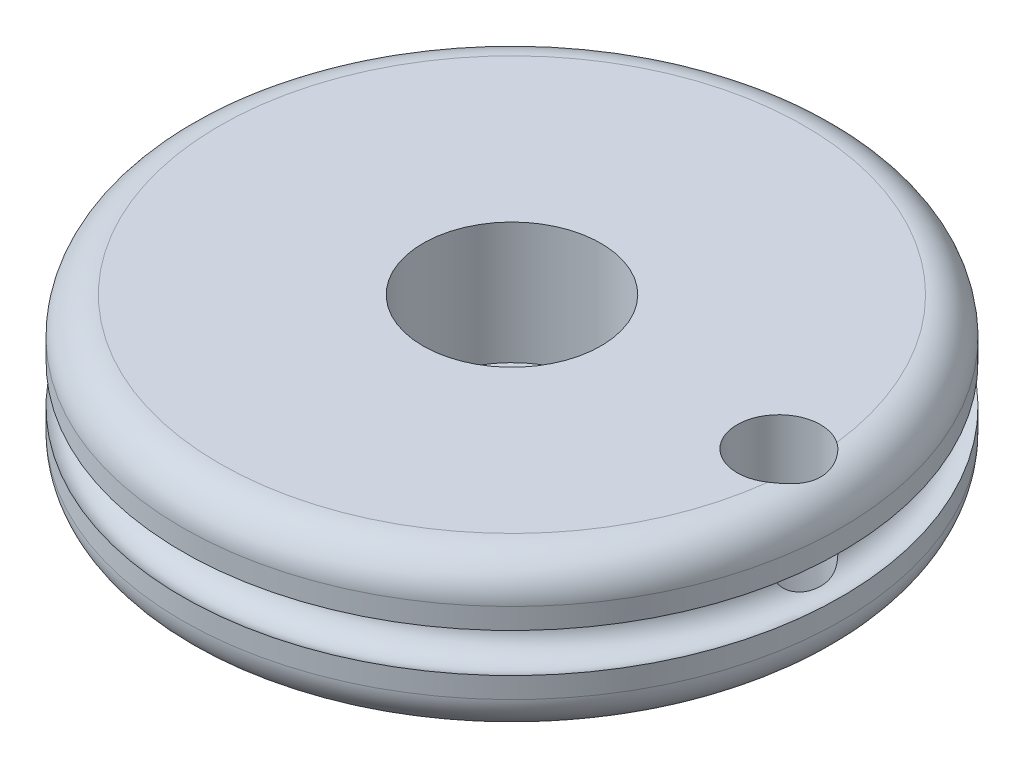
ISO-10303-21;
HEADER;
FILE_DESCRIPTION(('STEP AP214'),'2;1');
FILE_NAME('part.step','',(''),(''),'','','');
FILE_SCHEMA(('AUTOMOTIVE_DESIGN { 1 0 10303 214 1 1 1 1 }'));
ENDSEC;
DATA;
#1=APPLICATION_CONTEXT('core data for automotive mechanical design processes');
#2=APPLICATION_PROTOCOL_DEFINITION('international standard','automotive_design',2000,#1);
#3=PRODUCT_CONTEXT('',#1,'mechanical');
#4=PRODUCT('Part','Part','',(#3));
#5=PRODUCT_RELATED_PRODUCT_CATEGORY('part','',(#4));
#6=PRODUCT_DEFINITION_FORMATION('','',#4);
#7=PRODUCT_DEFINITION_CONTEXT('part definition',#1,'design');
#8=PRODUCT_DEFINITION('design','',#6,#7);
#9=PRODUCT_DEFINITION_SHAPE('','',#8);
#10=(LENGTH_UNIT() NAMED_UNIT(*) SI_UNIT(.MILLI.,.METRE.));
#11=(NAMED_UNIT(*) PLANE_ANGLE_UNIT() SI_UNIT($,.RADIAN.));
#12=(NAMED_UNIT(*) SI_UNIT($,.STERADIAN.) SOLID_ANGLE_UNIT());
#13=UNCERTAINTY_MEASURE_WITH_UNIT(LENGTH_MEASURE(1.E-05),#10,'distance_accuracy_value','');
#14=(GEOMETRIC_REPRESENTATION_CONTEXT(3) GLOBAL_UNCERTAINTY_ASSIGNED_CONTEXT((#13)) GLOBAL_UNIT_ASSIGNED_CONTEXT((#10,
#11,#12)) REPRESENTATION_CONTEXT('',''));
#15=CARTESIAN_POINT('',(0.,0.,0.));
#16=DIRECTION('',(0.,0.,1.));
#17=DIRECTION('',(1.,0.,0.));
#18=AXIS2_PLACEMENT_3D('',#15,#16,#17);
#19=CARTESIAN_POINT('',(0.,4.175,0.));
#20=DIRECTION('',(0.,-1.,0.));
#21=DIRECTION('',(0.,0.,-1.));
#22=AXIS2_PLACEMENT_3D('',#19,#20,#21);
#23=CYLINDRICAL_SURFACE('',#22,8.88999999999999);
#24=CARTESIAN_POINT('',(0.,1.,0.));
#25=DIRECTION('',(0.,1.,0.));
#26=DIRECTION('',(0.,0.,1.));
#27=AXIS2_PLACEMENT_3D('',#24,#25,#26);
#28=CIRCLE('',#27,8.88999999999999);
#29=CARTESIAN_POINT('',(0.,1.,8.88999999999999));
#30=VERTEX_POINT('',#29);
#31=EDGE_CURVE('E110',#30,#30,#28,.T.);
#32=ORIENTED_EDGE('',*,*,#31,.T.);
#33=EDGE_LOOP('',(#32));
#34=FACE_BOUND('',#33,.T.);
#35=CARTESIAN_POINT('',(0.,1.56079443709032,0.));
#36=DIRECTION('',(0.,1.,0.));
#37=DIRECTION('',(0.,0.,1.));
#38=AXIS2_PLACEMENT_3D('',#35,#36,#37);
#39=CIRCLE('',#38,8.88999999999999);
#40=CARTESIAN_POINT('',(0.,1.56079443709032,-8.88999999999999));
#41=VERTEX_POINT('',#40);
#42=EDGE_CURVE('E87',#41,#41,#39,.F.);
#43=ORIENTED_EDGE('',*,*,#42,.T.);
#44=EDGE_LOOP('',(#43));
#45=FACE_BOUND('',#44,.T.);
#46=ADVANCED_FACE('F47',(#34,#45),#23,.T.);
#47=CARTESIAN_POINT('',(0.,4.175,0.));
#48=DIRECTION('',(0.,-1.,0.));
#49=DIRECTION('',(0.,0.,-1.));
#50=AXIS2_PLACEMENT_3D('',#47,#48,#49);
#51=CYLINDRICAL_SURFACE('',#50,0.9);
#52=CARTESIAN_POINT('',(0.,0.,0.));
#53=DIRECTION('',(0.,1.,0.));
#54=DIRECTION('',(0.,0.,1.));
#55=AXIS2_PLACEMENT_3D('',#52,#53,#54);
#56=CIRCLE('',#55,0.9);
#57=CARTESIAN_POINT('',(0.,0.,0.9));
#58=VERTEX_POINT('',#57);
#59=EDGE_CURVE('E104',#58,#58,#56,.T.);
#60=ORIENTED_EDGE('',*,*,#59,.F.);
#61=EDGE_LOOP('',(#60));
#62=FACE_BOUND('',#61,.T.);
#63=CARTESIAN_POINT('',(0.,0.889,0.));
#64=DIRECTION('',(0.,1.,0.));
#65=DIRECTION('',(0.,0.,1.));
#66=AXIS2_PLACEMENT_3D('',#63,#64,#65);
#67=CIRCLE('',#66,0.9);
#68=CARTESIAN_POINT('',(0.,0.889,0.9));
#69=VERTEX_POINT('',#68);
#70=EDGE_CURVE('E99',#69,#69,#67,.T.);
#71=ORIENTED_EDGE('',*,*,#70,.T.);
#72=EDGE_LOOP('',(#71));
#73=FACE_BOUND('',#72,.T.);
#74=ADVANCED_FACE('F142',(#62,#73),#51,.F.);
#75=CARTESIAN_POINT('',(0.,4.175,0.));
#76=DIRECTION('',(0.,1.,0.));
#77=DIRECTION('',(0.,0.,1.));
#78=AXIS2_PLACEMENT_3D('',#75,#76,#77);
#79=PLANE('',#78);
#80=CARTESIAN_POINT('',(0.,4.175,0.));
#81=DIRECTION('',(0.,1.,0.));
#82=DIRECTION('',(0.,0.,1.));
#83=AXIS2_PLACEMENT_3D('',#80,#81,#82);
#84=CIRCLE('',#83,2.4);
#85=CARTESIAN_POINT('',(0.,4.175,2.4));
#86=VERTEX_POINT('',#85);
#87=EDGE_CURVE('E95',#86,#86,#84,.T.);
#88=ORIENTED_EDGE('',*,*,#87,.F.);
#89=EDGE_LOOP('',(#88));
#90=FACE_BOUND('',#89,.T.);
#91=CARTESIAN_POINT('',(7.2,4.175,0.));
#92=DIRECTION('',(0.,1.,0.));
#93=DIRECTION('',(0.,0.,1.));
#94=AXIS2_PLACEMENT_3D('',#91,#92,#93);
#95=CIRCLE('',#94,1.125);
#96=CARTESIAN_POINT('',(7.83517187499999,4.175,-0.928537392466773));
#97=VERTEX_POINT('',#96);
#98=CARTESIAN_POINT('',(7.83517187499999,4.175,0.928537392466773));
#99=VERTEX_POINT('',#98);
#100=EDGE_CURVE('E102',#97,#99,#95,.T.);
#101=ORIENTED_EDGE('',*,*,#100,.F.);
#102=CARTESIAN_POINT('',(0.,4.175,0.));
#103=DIRECTION('',(0.,1.,0.));
#104=DIRECTION('',(0.,0.,1.));
#105=AXIS2_PLACEMENT_3D('',#102,#103,#104);
#106=CIRCLE('',#105,7.88999999999999);
#107=EDGE_CURVE('E56',#97,#99,#106,.T.);
#108=ORIENTED_EDGE('',*,*,#107,.T.);
#109=EDGE_LOOP('',(#101,#108));
#110=FACE_BOUND('',#109,.T.);
#111=ADVANCED_FACE('F148',(#90,#110),#79,.T.);
#112=CARTESIAN_POINT('',(0.,0.,0.));
#113=DIRECTION('',(0.,1.,0.));
#114=DIRECTION('',(0.,0.,1.));
#115=AXIS2_PLACEMENT_3D('',#112,#113,#114);
#116=PLANE('',#115);
#117=ORIENTED_EDGE('',*,*,#59,.T.);
#118=EDGE_LOOP('',(#117));
#119=FACE_BOUND('',#118,.T.);
#120=CARTESIAN_POINT('',(7.2,0.,0.));
#121=DIRECTION('',(0.,1.,0.));
#122=DIRECTION('',(0.,0.,1.));
#123=AXIS2_PLACEMENT_3D('',#120,#121,#122);
#124=CIRCLE('',#123,1.125);
#125=CARTESIAN_POINT('',(7.83517187499999,0.,-0.928537392466773));
#126=VERTEX_POINT('',#125);
#127=CARTESIAN_POINT('',(7.83517187499999,0.,0.928537392466773));
#128=VERTEX_POINT('',#127);
#129=EDGE_CURVE('E105',#126,#128,#124,.T.);
#130=ORIENTED_EDGE('',*,*,#129,.T.);
#131=CARTESIAN_POINT('',(0.,0.,0.));
#132=DIRECTION('',(0.,1.,0.));
#133=DIRECTION('',(0.,0.,1.));
#134=AXIS2_PLACEMENT_3D('',#131,#132,#133);
#135=CIRCLE('',#134,7.88999999999999);
#136=EDGE_CURVE('E189',#128,#126,#135,.F.);
#137=ORIENTED_EDGE('',*,*,#136,.T.);
#138=EDGE_LOOP('',(#130,#137));
#139=FACE_BOUND('',#138,.T.);
#140=ADVANCED_FACE('F154',(#119,#139),#116,.F.);
#141=CARTESIAN_POINT('',(0.,3.175,0.));
#142=DIRECTION('',(0.,1.,0.));
#143=DIRECTION('',(0.,0.,1.));
#144=AXIS2_PLACEMENT_3D('',#141,#142,#143);
#145=CIRCLE('',#144,8.88999999999999);
#146=CARTESIAN_POINT('',(0.,3.175,8.88999999999999));
#147=VERTEX_POINT('',#146);
#148=EDGE_CURVE('E12',#147,#147,#145,.F.);
#149=ORIENTED_EDGE('',*,*,#148,.T.);
#150=EDGE_LOOP('',(#149));
#151=FACE_BOUND('',#150,.T.);
#152=CARTESIAN_POINT('',(0.,2.61420556290968,0.));
#153=DIRECTION('',(0.,-1.,0.));
#154=DIRECTION('',(0.,0.,-1.));
#155=AXIS2_PLACEMENT_3D('',#152,#153,#154);
#156=CIRCLE('',#155,8.88999999999999);
#157=CARTESIAN_POINT('',(0.,2.61420556290968,-8.88999999999999));
#158=VERTEX_POINT('',#157);
#159=EDGE_CURVE('E85',#158,#158,#156,.F.);
#160=ORIENTED_EDGE('',*,*,#159,.T.);
#161=EDGE_LOOP('',(#160));
#162=FACE_BOUND('',#161,.T.);
#163=ADVANCED_FACE('F137',(#151,#162),#23,.T.);
#164=CARTESIAN_POINT('',(7.2,4.175,0.));
#165=DIRECTION('',(0.,-1.,0.));
#166=DIRECTION('',(0.,0.,-1.));
#167=AXIS2_PLACEMENT_3D('',#164,#165,#166);
#168=CYLINDRICAL_SURFACE('',#167,1.125);
#169=CARTESIAN_POINT('',(7.9298103265932,1.9382119417605,-0.856155293857506));
#170=CARTESIAN_POINT('',(7.93721631453655,1.91150053374075,-0.849842361665816));
#171=CARTESIAN_POINT('',(7.9465006764239,1.88571497519308,-0.841768870301621));
#172=CARTESIAN_POINT('',(7.96799893054887,1.83680058440614,-0.82219955992322));
#173=CARTESIAN_POINT('',(7.9802156475675,1.81367434589714,-0.810700438357551));
#174=CARTESIAN_POINT('',(8.00647067360436,1.77069800787568,-0.784582154954621));
#175=CARTESIAN_POINT('',(8.0204968466173,1.75082792235051,-0.769983395079688));
#176=CARTESIAN_POINT('',(8.04942483167867,1.71430510266015,-0.737949490997834));
#177=CARTESIAN_POINT('',(8.06432680913564,1.69765297881733,-0.720513809889891));
#178=CARTESIAN_POINT('',(8.09969928525013,1.66175685858149,-0.67619220635362));
#179=CARTESIAN_POINT('',(8.1201704177166,1.64386842508515,-0.648209160094238));
#180=CARTESIAN_POINT('',(8.15941998320156,1.61300149885493,-0.58857698322613));
#181=CARTESIAN_POINT('',(8.17819461047729,1.60003384622355,-0.556919957009959));
#182=CARTESIAN_POINT('',(8.21848556784517,1.57450141643541,-0.480338654851271));
#183=CARTESIAN_POINT('',(8.23897558767256,1.56337572440598,-0.434396384806084));
#184=CARTESIAN_POINT('',(8.27377881247253,1.54590835440227,-0.339405182418532));
#185=CARTESIAN_POINT('',(8.28808742015443,1.53957023446734,-0.290353968849927));
#186=CARTESIAN_POINT('',(8.31013169796835,1.53022904022012,-0.189576760600147));
#187=CARTESIAN_POINT('',(8.31774599964334,1.52728725575377,-0.137818717648168));
#188=CARTESIAN_POINT('',(8.32570990034182,1.5242187129296,-0.0336619699986529));
#189=CARTESIAN_POINT('',(8.32605745257838,1.524092747688,0.0187369110421487));
#190=CARTESIAN_POINT('',(8.31906987399956,1.52676959191996,0.12939700531973));
#191=CARTESIAN_POINT('',(8.31079138250839,1.52993192982996,0.187592714953173));
#192=CARTESIAN_POINT('',(8.28538122101904,1.54073605727805,0.30161675608711));
#193=CARTESIAN_POINT('',(8.26825343502147,1.54837588182181,0.35744611456874));
#194=CARTESIAN_POINT('',(8.23151291136029,1.56749489766642,0.45106512826864));
#195=CARTESIAN_POINT('',(8.21363325546144,1.57750814723058,0.48983784986429));
#196=CARTESIAN_POINT('',(8.17439034599932,1.6025181465839,0.563851955842771));
#197=CARTESIAN_POINT('',(8.15303363656654,1.61750558848583,0.599099777029292));
#198=CARTESIAN_POINT('',(8.11383324198597,1.64947210680059,0.656844784246196));
#199=CARTESIAN_POINT('',(8.09639008024526,1.66509156312029,0.680363407872724));
#200=CARTESIAN_POINT('',(8.06151343834049,1.70053178543826,0.724013759580503));
#201=CARTESIAN_POINT('',(8.04407997369363,1.72034723011795,0.744149720064756));
#202=CARTESIAN_POINT('',(8.01342749901724,1.76071442816635,0.777423321542925));
#203=CARTESIAN_POINT('',(7.99998940099915,1.78059738593079,0.791167839794292));
#204=CARTESIAN_POINT('',(7.97505164977839,1.82326163806606,0.815613318484649));
#205=CARTESIAN_POINT('',(7.9635514911614,1.84604217402077,0.826315072977917));
#206=CARTESIAN_POINT('',(7.94334882705368,1.89416101209038,0.844538437198911));
#207=CARTESIAN_POINT('',(7.93466088008594,1.91951175940842,0.852043559570732));
#208=CARTESIAN_POINT('',(7.92091174003376,1.97191676373309,0.863709437455477));
#209=CARTESIAN_POINT('',(7.91584960993924,1.99897057865305,0.867871057054673));
#210=CARTESIAN_POINT('',(7.91007711530322,2.05124112669383,0.872598191750707));
#211=CARTESIAN_POINT('',(7.90900212056039,2.07639121756347,0.873465211253352));
#212=CARTESIAN_POINT('',(7.91026259832995,2.12654427348054,0.872440759510253));
#213=CARTESIAN_POINT('',(7.9125970037929,2.15154728210204,0.870550151327137));
#214=CARTESIAN_POINT('',(7.92038458060981,2.19991229633915,0.864115190602682));
#215=CARTESIAN_POINT('',(7.92574096356867,2.22330107494038,0.859653106739275));
#216=CARTESIAN_POINT('',(7.93913478940596,2.2686286101843,0.848163930030742));
#217=CARTESIAN_POINT('',(7.94717220054204,2.29056738399081,0.841136867553884));
#218=CARTESIAN_POINT('',(7.96570635025086,2.33321250339639,0.824305595432791));
#219=CARTESIAN_POINT('',(7.97627620405164,2.35385329617834,0.814416540318993));
#220=CARTESIAN_POINT('',(7.99902433139546,2.3927313444568,0.792110217832894));
#221=CARTESIAN_POINT('',(8.0112030693567,2.41096790290205,0.779692219896901));
#222=CARTESIAN_POINT('',(8.03778034859942,2.44668607310268,0.751110556635125));
#223=CARTESIAN_POINT('',(8.05227773631489,2.46388787062349,0.734690632253791));
#224=CARTESIAN_POINT('',(8.08149374083744,2.49527813116678,0.699372291223382));
#225=CARTESIAN_POINT('',(8.09621249443996,2.50946464142441,0.680472281152618));
#226=CARTESIAN_POINT('',(8.13269490169488,2.54176245664423,0.630159545949316));
#227=CARTESIAN_POINT('',(8.15413840683721,2.55807397651509,0.597353838099175));
#228=CARTESIAN_POINT('',(8.1941803858522,2.5856109298613,0.528058950117507));
#229=CARTESIAN_POINT('',(8.21277176129199,2.59682380558043,0.491560943121617));
#230=CARTESIAN_POINT('',(8.25084725209566,2.618032413062,0.40516175044907));
#231=CARTESIAN_POINT('',(8.26908068856531,2.62677439415708,0.354401421561036));
#232=CARTESIAN_POINT('',(8.29813735038162,2.63987328607102,0.250301795871059));
#233=CARTESIAN_POINT('',(8.30895786845396,2.6442285951047,0.196961564467925));
#234=CARTESIAN_POINT('',(8.32285725408344,2.6497217490954,0.0885232764594204));
#235=CARTESIAN_POINT('',(8.32584933462433,2.6508235422623,0.0334123146294885));
#236=CARTESIAN_POINT('',(8.32373491751773,2.65001787467228,-0.0766638356913661));
#237=CARTESIAN_POINT('',(8.31862344921356,2.64810856693218,-0.131628913979828));
#238=CARTESIAN_POINT('',(8.2998208628168,2.64048430621047,-0.243897764038196));
#239=CARTESIAN_POINT('',(8.28554128305002,2.63450649382444,-0.301086948465016));
#240=CARTESIAN_POINT('',(8.24856310667281,2.61670676653593,-0.411723358580074));
#241=CARTESIAN_POINT('',(8.22587897957904,2.60489488416623,-0.465176828874669));
#242=CARTESIAN_POINT('',(8.18304312154811,2.57818780116365,-0.548288545081979));
#243=CARTESIAN_POINT('',(8.16477581828095,2.56581187714857,-0.579735263719842));
#244=CARTESIAN_POINT('',(8.12646691197597,2.53637525273644,-0.639158075394354));
#245=CARTESIAN_POINT('',(8.10642883082297,2.51932371557745,-0.667140803038483));
#246=CARTESIAN_POINT('',(8.07023684123618,2.48373762299544,-0.713439285838585));
#247=CARTESIAN_POINT('',(8.0541248484857,2.46621597145157,-0.732562418201187));
#248=CARTESIAN_POINT('',(8.02282602288835,2.42744111435356,-0.767549502923553));
#249=CARTESIAN_POINT('',(8.00763895518916,2.40618886142068,-0.78341428507482));
#250=CARTESIAN_POINT('',(7.97932569094289,2.35989426153748,-0.811591442697119));
#251=CARTESIAN_POINT('',(7.96621736480078,2.33482233920895,-0.823873704078336));
#252=CARTESIAN_POINT('',(7.94349860110067,2.28162389637194,-0.844436128783867));
#253=CARTESIAN_POINT('',(7.93388582070132,2.25349943826024,-0.852718973887025));
#254=CARTESIAN_POINT('',(7.92018912771332,2.19933286833218,-0.864303994781009));
#255=CARTESIAN_POINT('',(7.91551907059629,2.17355151738437,-0.868141602244685));
#256=CARTESIAN_POINT('',(7.90986797030007,2.12132666398989,-0.872769592205524));
#257=CARTESIAN_POINT('',(7.90888419262348,2.09488366701973,-0.87356223348227));
#258=CARTESIAN_POINT('',(7.9105353805534,2.04633261629288,-0.872217980880229));
#259=CARTESIAN_POINT('',(7.91263032320164,2.02419116717591,-0.870518351401516));
#260=CARTESIAN_POINT('',(7.91937024750617,1.98058149649814,-0.864956905031678));
#261=CARTESIAN_POINT('',(7.92401523580705,1.95911327669172,-0.861095082506572));
#262=CARTESIAN_POINT('',(7.9298103265932,1.9382119417605,-0.856155293857506));
#263=B_SPLINE_CURVE_WITH_KNOTS('',3,(#169,#170,#171,#172,#173,#174,#175,#176,#177,#178,#179,
#180,#181,#182,#183,#184,#185,#186,#187,#188,#189,#190,#191,#192,#193,#194,#195,#196,#197,#198,
#199,#200,#201,#202,#203,#204,#205,#206,#207,#208,#209,#210,#211,#212,#213,#214,#215,#216,#217,
#218,#219,#220,#221,#222,#223,#224,#225,#226,#227,#228,#229,#230,#231,#232,#233,#234,#235,#236,
#237,#238,#239,#240,#241,#242,#243,#244,#245,#246,#247,#248,#249,#250,#251,#252,#253,#254,#255,
#256,#257,#258,#259,#260,#261,#262),.UNSPECIFIED.,.T.,.F.,(4,2,2,2,2,2,2,2,2,2,2,2,2,2,2,2,2,2,
2,2,2,2,2,2,2,2,2,2,2,2,2,2,2,2,2,2,2,2,2,2,2,2,2,2,2,2,4),(0.,0.0851867120221367,
0.170455817350227,0.255180173894778,0.339920583622904,0.456316858744739,0.572968077585646,
0.726709391762604,0.880564851667378,1.03715538955168,1.19379003287187,1.36955225904617,
1.54523740773075,1.67634742968004,1.8072134842325,1.90641108604327,2.00548363171938,
2.08810290434446,2.17070059641547,2.25371929225723,2.33671652605262,2.41190486133118,
2.48706966974997,2.55995360484294,2.63283667704871,2.70815176588201,2.78348864275978,
2.86672745438076,2.95002001009003,3.07666040911733,3.20361105100614,3.3666774836166,
3.52980343806975,3.69473031067443,3.85975838734606,4.0366101079852,4.21315875967521,
4.32802183624078,4.4426613941945,4.5339042782677,4.62512389697555,4.71708954505503,
4.8089934403196,4.88801414603352,4.96697622224175,5.0336335605178,5.10029107248224),.UNSPECIFIED.);
#264=CARTESIAN_POINT('',(7.9298103265932,1.9382119417605,-0.856155293857506));
#265=VERTEX_POINT('',#264);
#266=EDGE_CURVE('E88',#265,#265,#263,.T.);
#267=ORIENTED_EDGE('',*,*,#266,.F.);
#268=EDGE_LOOP('',(#267));
#269=FACE_BOUND('',#268,.T.);
#270=ORIENTED_EDGE('',*,*,#100,.T.);
#271=CARTESIAN_POINT('',(7.83517187499999,4.175,0.928537392466773));
#272=CARTESIAN_POINT('',(7.88555108467362,4.17497152281548,0.894122994058825));
#273=CARTESIAN_POINT('',(7.93291278541867,4.17183610684726,0.855669006976404));
#274=CARTESIAN_POINT('',(8.02051971726969,4.16167976515977,0.772012674517859));
#275=CARTESIAN_POINT('',(8.06078656632049,4.15467092154018,0.72683163091962));
#276=CARTESIAN_POINT('',(8.1333401700734,4.13909008810844,0.630964089122732));
#277=CARTESIAN_POINT('',(8.16564993727927,4.13052273361983,0.580294092282025));
#278=CARTESIAN_POINT('',(8.22186326151028,4.11383373437663,0.47435811655545));
#279=CARTESIAN_POINT('',(8.24575995159527,4.10571245826278,0.41908842857896));
#280=CARTESIAN_POINT('',(8.28569186539508,4.09130572338503,0.301624132765067));
#281=CARTESIAN_POINT('',(8.30114938771658,4.08516489161598,0.239212648097851));
#282=CARTESIAN_POINT('',(8.32120198188964,4.07706156840105,0.112432631807389));
#283=CARTESIAN_POINT('',(8.32580712300342,4.07509520388987,0.0480659704962507));
#284=CARTESIAN_POINT('',(8.32402292976484,4.07583683115967,-0.0760591270462988));
#285=CARTESIAN_POINT('',(8.31836452351553,4.07823410485576,-0.135831439660588));
#286=CARTESIAN_POINT('',(8.29769466536161,4.08652710335984,-0.253503474111269));
#287=CARTESIAN_POINT('',(8.28267747686402,4.09242497380063,-0.311402024484975));
#288=CARTESIAN_POINT('',(8.24380863581775,4.10638191329989,-0.423823662932206));
#289=CARTESIAN_POINT('',(8.21996068449986,4.11444007652651,-0.478348154014217));
#290=CARTESIAN_POINT('',(8.16404427015713,4.13095535019464,-0.582889018825646));
#291=CARTESIAN_POINT('',(8.13198009146138,4.13941225084587,-0.632907723768085));
#292=CARTESIAN_POINT('',(8.05985740536359,4.15483917573083,-0.727907653319978));
#293=CARTESIAN_POINT('',(8.01972447887388,4.16179400595546,-0.772835396905714));
#294=CARTESIAN_POINT('',(7.93246090353533,4.17186622581851,-0.856035599674633));
#295=CARTESIAN_POINT('',(7.88530983971155,4.17497216508869,-0.894287910954872));
#296=CARTESIAN_POINT('',(7.83517187499999,4.175,-0.928537392466773));
#297=B_SPLINE_CURVE_WITH_KNOTS('',3,(#271,#272,#273,#274,#275,#276,#277,#278,#279,#280,#281,
#282,#283,#284,#285,#286,#287,#288,#289,#290,#291,#292,#293,#294,#295,#296),.UNSPECIFIED.,.F.,
.F.,(4,2,2,2,2,2,2,2,2,2,2,2,4),(0.,0.18246190068938,0.364357847635038,0.545721391087639,
0.727232626144017,0.919971249960136,1.11253097283915,1.29191122385612,1.47140153673353,
1.65081670496931,1.83013850737079,2.01119708056692,2.19279301597132),.UNSPECIFIED.);
#298=EDGE_CURVE('E62',#99,#97,#297,.T.);
#299=ORIENTED_EDGE('',*,*,#298,.T.);
#300=EDGE_LOOP('',(#270,#299));
#301=FACE_BOUND('',#300,.T.);
#302=ORIENTED_EDGE('',*,*,#129,.F.);
#303=CARTESIAN_POINT('',(7.83517187499999,0.,-0.928537392466773));
#304=CARTESIAN_POINT('',(7.88555108467362,2.84771845164659E-05,-0.894122994058825));
#305=CARTESIAN_POINT('',(7.93291278541867,0.00316389315274315,-0.855669006976405));
#306=CARTESIAN_POINT('',(8.02051971726969,0.0133202348402319,-0.77201267451786));
#307=CARTESIAN_POINT('',(8.06078656632049,0.0203290784598178,-0.72683163091962));
#308=CARTESIAN_POINT('',(8.1333401700734,0.035909911891565,-0.630964089122732));
#309=CARTESIAN_POINT('',(8.16564993727927,0.0444772663801697,-0.580294092282025));
#310=CARTESIAN_POINT('',(8.22186326151028,0.061166265623368,-0.47435811655545));
#311=CARTESIAN_POINT('',(8.24575995159527,0.0692875417372187,-0.41908842857896));
#312=CARTESIAN_POINT('',(8.28569186539508,0.0836942766149645,-0.301624132765067));
#313=CARTESIAN_POINT('',(8.30114938771658,0.0898351083840157,-0.23921264809785));
#314=CARTESIAN_POINT('',(8.32120198188964,0.0979384315989546,-0.112432631807389));
#315=CARTESIAN_POINT('',(8.32580712300342,0.0999047961101271,-0.0480659704962505));
#316=CARTESIAN_POINT('',(8.32402292976484,0.0991631688403337,0.0760591270462989));
#317=CARTESIAN_POINT('',(8.31836452351553,0.0967658951442417,0.135831439660588));
#318=CARTESIAN_POINT('',(8.29769466536161,0.088472896640156,0.253503474111269));
#319=CARTESIAN_POINT('',(8.28267747686402,0.0825750261993677,0.311402024484975));
#320=CARTESIAN_POINT('',(8.24380863581775,0.068618086700112,0.423823662932206));
#321=CARTESIAN_POINT('',(8.21996068449986,0.0605599234734885,0.478348154014217));
#322=CARTESIAN_POINT('',(8.16404427015713,0.044044649805355,0.582889018825646));
#323=CARTESIAN_POINT('',(8.13198009146138,0.0355877491541262,0.632907723768085));
#324=CARTESIAN_POINT('',(8.05985740536359,0.0201608242691684,0.727907653319978));
#325=CARTESIAN_POINT('',(8.01972447887388,0.0132059940445456,0.772835396905714));
#326=CARTESIAN_POINT('',(7.93246090353533,0.00313377418148778,0.856035599674633));
#327=CARTESIAN_POINT('',(7.88530983971155,2.78349113060877E-05,0.894287910954872));
#328=CARTESIAN_POINT('',(7.83517187499999,0.,0.928537392466774));
#329=B_SPLINE_CURVE_WITH_KNOTS('',3,(#303,#304,#305,#306,#307,#308,#309,#310,#311,#312,#313,
#314,#315,#316,#317,#318,#319,#320,#321,#322,#323,#324,#325,#326,#327,#328),.UNSPECIFIED.,.F.,
.F.,(4,2,2,2,2,2,2,2,2,2,2,2,4),(0.,0.18246190068938,0.364357847635038,0.545721391087639,
0.727232626144017,0.919971249960136,1.11253097283915,1.29191122385612,1.47140153673353,
1.65081670496931,1.83013850737079,2.01119708056692,2.19279301597132),.UNSPECIFIED.);
#330=EDGE_CURVE('E173',#126,#128,#329,.T.);
#331=ORIENTED_EDGE('',*,*,#330,.T.);
#332=EDGE_LOOP('',(#302,#331));
#333=FACE_BOUND('',#332,.T.);
#334=ADVANCED_FACE('F119',(#269,#301,#333),#168,.F.);
#335=CARTESIAN_POINT('',(0.,0.889,0.));
#336=DIRECTION('',(0.,1.,0.));
#337=DIRECTION('',(0.,0.,1.));
#338=AXIS2_PLACEMENT_3D('',#335,#336,#337);
#339=CYLINDRICAL_SURFACE('',#338,2.4);
#340=CARTESIAN_POINT('',(0.,0.889,0.));
#341=DIRECTION('',(0.,1.,0.));
#342=DIRECTION('',(0.,0.,1.));
#343=AXIS2_PLACEMENT_3D('',#340,#341,#342);
#344=CIRCLE('',#343,2.4);
#345=CARTESIAN_POINT('',(0.,0.889,2.4));
#346=VERTEX_POINT('',#345);
#347=EDGE_CURVE('E96',#346,#346,#344,.T.);
#348=CARTESIAN_POINT('',(0.,0.889,2.4));
#349=CARTESIAN_POINT('',(0.,0.923229166666667,2.4));
#350=CARTESIAN_POINT('',(0.,0.957458333333333,2.4));
#351=CARTESIAN_POINT('',(0.,1.02591666666667,2.4));
#352=CARTESIAN_POINT('',(0.,1.06014583333333,2.4));
#353=CARTESIAN_POINT('',(0.,1.12860416666667,2.4));
#354=CARTESIAN_POINT('',(0.,1.16283333333333,2.4));
#355=CARTESIAN_POINT('',(0.,1.23129166666667,2.4));
#356=CARTESIAN_POINT('',(0.,1.26552083333333,2.4));
#357=CARTESIAN_POINT('',(0.,1.33397916666667,2.4));
#358=CARTESIAN_POINT('',(0.,1.36820833333333,2.4));
#359=CARTESIAN_POINT('',(0.,1.43666666666667,2.4));
#360=CARTESIAN_POINT('',(0.,1.47089583333333,2.4));
#361=CARTESIAN_POINT('',(0.,1.53935416666667,2.4));
#362=CARTESIAN_POINT('',(0.,1.57358333333333,2.4));
#363=CARTESIAN_POINT('',(0.,1.64204166666667,2.4));
#364=CARTESIAN_POINT('',(0.,1.67627083333333,2.4));
#365=CARTESIAN_POINT('',(0.,1.74472916666667,2.4));
#366=CARTESIAN_POINT('',(0.,1.77895833333333,2.4));
#367=CARTESIAN_POINT('',(0.,1.84741666666667,2.4));
#368=CARTESIAN_POINT('',(0.,1.88164583333333,2.4));
#369=CARTESIAN_POINT('',(0.,1.95010416666667,2.4));
#370=CARTESIAN_POINT('',(0.,1.98433333333333,2.4));
#371=CARTESIAN_POINT('',(0.,2.05279166666667,2.4));
#372=CARTESIAN_POINT('',(0.,2.08702083333333,2.4));
#373=CARTESIAN_POINT('',(0.,2.15547916666667,2.4));
#374=CARTESIAN_POINT('',(0.,2.18970833333333,2.4));
#375=CARTESIAN_POINT('',(0.,2.25816666666667,2.4));
#376=CARTESIAN_POINT('',(0.,2.29239583333333,2.4));
#377=CARTESIAN_POINT('',(0.,2.36085416666667,2.4));
#378=CARTESIAN_POINT('',(0.,2.39508333333333,2.4));
#379=CARTESIAN_POINT('',(0.,2.46354166666667,2.4));
#380=CARTESIAN_POINT('',(0.,2.49777083333333,2.4));
#381=CARTESIAN_POINT('',(0.,2.56622916666667,2.4));
#382=CARTESIAN_POINT('',(0.,2.60045833333333,2.4));
#383=CARTESIAN_POINT('',(0.,2.66891666666667,2.4));
#384=CARTESIAN_POINT('',(0.,2.70314583333333,2.4));
#385=CARTESIAN_POINT('',(0.,2.77160416666667,2.4));
#386=CARTESIAN_POINT('',(0.,2.80583333333333,2.4));
#387=CARTESIAN_POINT('',(0.,2.87429166666667,2.4));
#388=CARTESIAN_POINT('',(0.,2.90852083333333,2.4));
#389=CARTESIAN_POINT('',(0.,2.97697916666667,2.4));
#390=CARTESIAN_POINT('',(0.,3.01120833333333,2.4));
#391=CARTESIAN_POINT('',(0.,3.07966666666667,2.4));
#392=CARTESIAN_POINT('',(0.,3.11389583333333,2.4));
#393=CARTESIAN_POINT('',(0.,3.18235416666667,2.4));
#394=CARTESIAN_POINT('',(0.,3.21658333333333,2.4));
#395=CARTESIAN_POINT('',(0.,3.28504166666667,2.4));
#396=CARTESIAN_POINT('',(0.,3.31927083333333,2.4));
#397=CARTESIAN_POINT('',(0.,3.38772916666667,2.4));
#398=CARTESIAN_POINT('',(0.,3.42195833333333,2.4));
#399=CARTESIAN_POINT('',(0.,3.49041666666667,2.4));
#400=CARTESIAN_POINT('',(0.,3.52464583333333,2.4));
#401=CARTESIAN_POINT('',(0.,3.59310416666667,2.4));
#402=CARTESIAN_POINT('',(0.,3.62733333333333,2.4));
#403=CARTESIAN_POINT('',(0.,3.69579166666667,2.4));
#404=CARTESIAN_POINT('',(0.,3.73002083333333,2.4));
#405=CARTESIAN_POINT('',(0.,3.79847916666667,2.4));
#406=CARTESIAN_POINT('',(0.,3.83270833333333,2.4));
#407=CARTESIAN_POINT('',(0.,3.90116666666667,2.4));
#408=CARTESIAN_POINT('',(0.,3.93539583333333,2.4));
#409=CARTESIAN_POINT('',(0.,4.00385416666667,2.4));
#410=CARTESIAN_POINT('',(0.,4.03808333333333,2.4));
#411=CARTESIAN_POINT('',(0.,4.10654166666667,2.4));
#412=CARTESIAN_POINT('',(0.,4.14077083333333,2.4));
#413=CARTESIAN_POINT('',(0.,4.175,2.4));
#414=B_SPLINE_CURVE_WITH_KNOTS('',3,(#348,#349,#350,#351,#352,#353,#354,#355,#356,#357,#358,
#359,#360,#361,#362,#363,#364,#365,#366,#367,#368,#369,#370,#371,#372,#373,#374,#375,#376,#377,
#378,#379,#380,#381,#382,#383,#384,#385,#386,#387,#388,#389,#390,#391,#392,#393,#394,#395,#396,
#397,#398,#399,#400,#401,#402,#403,#404,#405,#406,#407,#408,#409,#410,#411,#412,#413),
.UNSPECIFIED.,.F.,.F.,(4,2,2,2,2,2,2,2,2,2,2,2,2,2,2,2,2,2,2,2,2,2,2,2,2,2,2,2,2,2,2,2,4),(0.,
0.1026875,0.205375,0.3080625,0.41075,0.5134375,0.616125,0.7188125,0.8215,0.9241875,1.026875,
1.1295625,1.23225,1.3349375,1.437625,1.5403125,1.643,1.7456875,1.848375,1.9510625,2.05375,
2.1564375,2.259125,2.3618125,2.4645,2.5671875,2.669875,2.7725625,2.87525,2.9779375,3.080625,
3.1833125,3.286),.UNSPECIFIED.);
#415=EDGE_CURVE('BSEAM130',#346,#86,#414,.T.);
#416=ORIENTED_EDGE('',*,*,#347,.F.);
#417=ORIENTED_EDGE('',*,*,#87,.T.);
#418=ORIENTED_EDGE('',*,*,#415,.T.);
#419=ORIENTED_EDGE('',*,*,#415,.F.);
#420=EDGE_LOOP('',(#416,#418,#417,#419));
#421=FACE_BOUND('',#420,.T.);
#422=ADVANCED_FACE('F130',(#421),#339,.F.);
#423=CARTESIAN_POINT('',(0.,0.889,0.));
#424=DIRECTION('',(0.,1.,0.));
#425=DIRECTION('',(0.,0.,1.));
#426=AXIS2_PLACEMENT_3D('',#423,#424,#425);
#427=PLANE('',#426);
#428=ORIENTED_EDGE('',*,*,#70,.F.);
#429=EDGE_LOOP('',(#428));
#430=FACE_BOUND('',#429,.T.);
#431=ORIENTED_EDGE('',*,*,#347,.T.);
#432=EDGE_LOOP('',(#431));
#433=FACE_BOUND('',#432,.T.);
#434=ADVANCED_FACE('F127',(#430,#433),#427,.T.);
#435=CARTESIAN_POINT('',(0.,2.0875,0.));
#436=DIRECTION('',(0.,-1.,0.));
#437=DIRECTION('',(0.,0.,-1.));
#438=AXIS2_PLACEMENT_3D('',#435,#436,#437);
#439=TOROIDAL_SURFACE('',#438,8.5725,0.614999999999999);
#440=ORIENTED_EDGE('',*,*,#266,.T.);
#441=EDGE_LOOP('',(#440));
#442=FACE_BOUND('',#441,.T.);
#443=CARTESIAN_POINT('',(0.,2.0875,-8.5725));
#444=DIRECTION('',(1.,0.,0.));
#445=DIRECTION('',(0.,0.,-1.));
#446=AXIS2_PLACEMENT_3D('',#443,#444,#445);
#447=CIRCLE('',#446,0.614999999999999);
#448=EDGE_CURVE('E82',#158,#41,#447,.T.);
#449=ORIENTED_EDGE('',*,*,#448,.F.);
#450=ORIENTED_EDGE('',*,*,#159,.F.);
#451=ORIENTED_EDGE('',*,*,#448,.T.);
#452=ORIENTED_EDGE('',*,*,#42,.F.);
#453=EDGE_LOOP('',(#449,#450,#451,#452));
#454=FACE_BOUND('',#453,.T.);
#455=ADVANCED_FACE('F83',(#442,#454),#439,.F.);
#456=CARTESIAN_POINT('',(0.,1.,0.));
#457=DIRECTION('',(0.,1.,0.));
#458=DIRECTION('',(0.,0.,1.));
#459=AXIS2_PLACEMENT_3D('',#456,#457,#458);
#460=TOROIDAL_SURFACE('',#459,7.88999999999999,1.);
#461=ORIENTED_EDGE('',*,*,#330,.F.);
#462=ORIENTED_EDGE('',*,*,#136,.F.);
#463=EDGE_LOOP('',(#461,#462));
#464=FACE_BOUND('',#463,.T.);
#465=ORIENTED_EDGE('',*,*,#31,.F.);
#466=EDGE_LOOP('',(#465));
#467=FACE_BOUND('',#466,.T.);
#468=ADVANCED_FACE('F126',(#464,#467),#460,.T.);
#469=CARTESIAN_POINT('',(0.,3.175,0.));
#470=DIRECTION('',(0.,1.,0.));
#471=DIRECTION('',(0.,0.,1.));
#472=AXIS2_PLACEMENT_3D('',#469,#470,#471);
#473=TOROIDAL_SURFACE('',#472,7.88999999999999,1.);
#474=ORIENTED_EDGE('',*,*,#148,.F.);
#475=EDGE_LOOP('',(#474));
#476=FACE_BOUND('',#475,.T.);
#477=ORIENTED_EDGE('',*,*,#298,.F.);
#478=ORIENTED_EDGE('',*,*,#107,.F.);
#479=EDGE_LOOP('',(#477,#478));
#480=FACE_BOUND('',#479,.T.);
#481=ADVANCED_FACE('F49',(#476,#480),#473,.T.);
#482=CLOSED_SHELL('',(#46,#74,#111,#140,#163,#334,#422,#434,#455,#468,#481));
#483=MANIFOLD_SOLID_BREP('B2',#482);
#484=ADVANCED_BREP_SHAPE_REPRESENTATION('',(#18,#483),#14);
#485=SHAPE_DEFINITION_REPRESENTATION(#9,#484);
ENDSEC;
END-ISO-10303-21;
